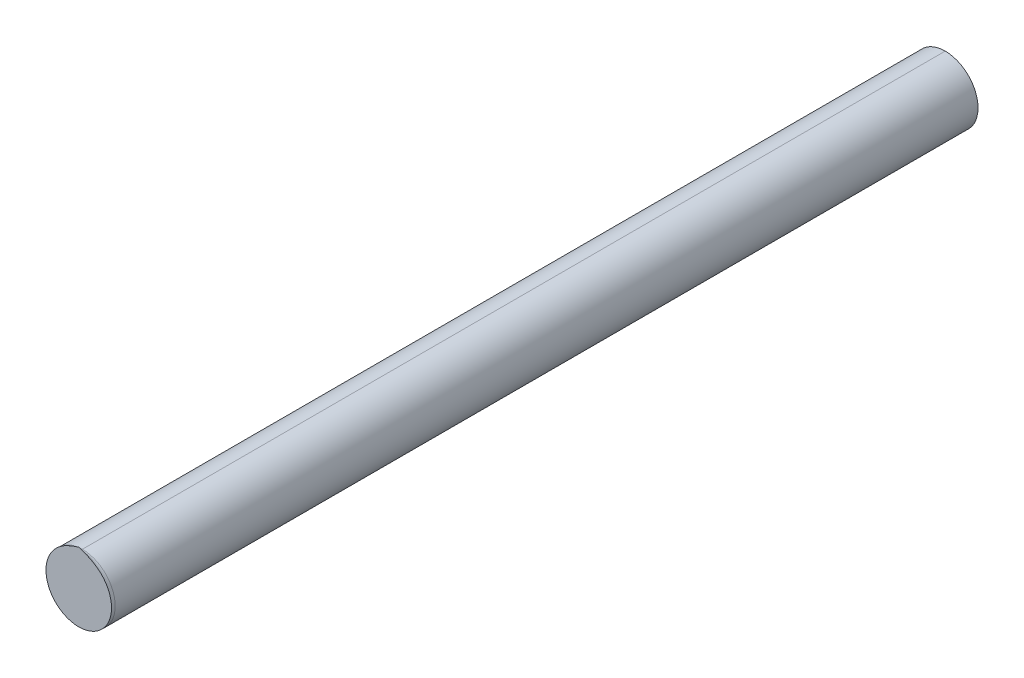
ISO-10303-21;
HEADER;
FILE_DESCRIPTION(('STEP AP214'),'2;1');
FILE_NAME('part.step','',(''),(''),'','','');
FILE_SCHEMA(('AUTOMOTIVE_DESIGN { 1 0 10303 214 1 1 1 1 }'));
ENDSEC;
DATA;
#1=APPLICATION_CONTEXT('core data for automotive mechanical design processes');
#2=APPLICATION_PROTOCOL_DEFINITION('international standard','automotive_design',2000,#1);
#3=PRODUCT_CONTEXT('',#1,'mechanical');
#4=PRODUCT('Part','Part','',(#3));
#5=PRODUCT_RELATED_PRODUCT_CATEGORY('part','',(#4));
#6=PRODUCT_DEFINITION_FORMATION('','',#4);
#7=PRODUCT_DEFINITION_CONTEXT('part definition',#1,'design');
#8=PRODUCT_DEFINITION('design','',#6,#7);
#9=PRODUCT_DEFINITION_SHAPE('','',#8);
#10=(LENGTH_UNIT() NAMED_UNIT(*) SI_UNIT(.MILLI.,.METRE.));
#11=(NAMED_UNIT(*) PLANE_ANGLE_UNIT() SI_UNIT($,.RADIAN.));
#12=(NAMED_UNIT(*) SI_UNIT($,.STERADIAN.) SOLID_ANGLE_UNIT());
#13=UNCERTAINTY_MEASURE_WITH_UNIT(LENGTH_MEASURE(1.E-05),#10,'distance_accuracy_value','');
#14=(GEOMETRIC_REPRESENTATION_CONTEXT(3) GLOBAL_UNCERTAINTY_ASSIGNED_CONTEXT((#13)) GLOBAL_UNIT_ASSIGNED_CONTEXT((#10,
#11,#12)) REPRESENTATION_CONTEXT('',''));
#15=CARTESIAN_POINT('',(0.,0.,0.));
#16=DIRECTION('',(0.,0.,1.));
#17=DIRECTION('',(1.,0.,0.));
#18=AXIS2_PLACEMENT_3D('',#15,#16,#17);
#19=CARTESIAN_POINT('',(0.0127,-2.2352,-7.3152));
#20=DIRECTION('',(0.,0.,1.));
#21=DIRECTION('',(1.,0.,0.));
#22=AXIS2_PLACEMENT_3D('',#19,#20,#21);
#23=PLANE('',#22);
#24=CARTESIAN_POINT('',(0.0127,-2.2352,-7.3152));
#25=DIRECTION('',(0.,0.,1.));
#26=DIRECTION('',(0.,1.,0.));
#27=AXIS2_PLACEMENT_3D('',#24,#25,#26);
#28=CIRCLE('',#27,0.2286);
#29=CARTESIAN_POINT('',(0.0127,-2.0066,-7.3152));
#30=VERTEX_POINT('',#29);
#31=CARTESIAN_POINT('',(0.0127,-2.4638,-7.3152));
#32=VERTEX_POINT('',#31);
#33=EDGE_CURVE('E86',#30,#32,#28,.T.);
#34=ORIENTED_EDGE('',*,*,#33,.F.);
#35=CARTESIAN_POINT('',(0.0127,-2.2352,-7.3152));
#36=DIRECTION('',(0.,0.,1.));
#37=DIRECTION('',(0.,-1.,0.));
#38=AXIS2_PLACEMENT_3D('',#35,#36,#37);
#39=CIRCLE('',#38,0.2286);
#40=EDGE_CURVE('E11',#32,#30,#39,.T.);
#41=ORIENTED_EDGE('',*,*,#40,.F.);
#42=EDGE_LOOP('',(#34,#41));
#43=FACE_BOUND('',#42,.T.);
#44=ADVANCED_FACE('F16',(#43),#23,.F.);
#45=CARTESIAN_POINT('',(0.0127,-2.2352,-1.175004));
#46=DIRECTION('',(0.,0.,1.));
#47=DIRECTION('',(0.,1.,0.));
#48=AXIS2_PLACEMENT_3D('',#45,#46,#47);
#49=CYLINDRICAL_SURFACE('',#48,0.2286);
#50=DIRECTION('',(0.,0.,1.));
#51=VECTOR('',#50,1.);
#52=CARTESIAN_POINT('',(0.0127,-2.4638,-7.3152));
#53=LINE('',#52,#51);
#54=CARTESIAN_POINT('',(0.0127,-2.4638,-1.2954));
#55=VERTEX_POINT('',#54);
#56=EDGE_CURVE('E27',#32,#55,#53,.T.);
#57=ORIENTED_EDGE('',*,*,#56,.F.);
#58=ORIENTED_EDGE('',*,*,#40,.T.);
#59=DIRECTION('',(0.,0.,-1.));
#60=VECTOR('',#59,1.);
#61=CARTESIAN_POINT('',(0.0127,-2.0066,-1.2954));
#62=LINE('',#61,#60);
#63=CARTESIAN_POINT('',(0.0127,-2.0066,-1.2954));
#64=VERTEX_POINT('',#63);
#65=EDGE_CURVE('E20',#64,#30,#62,.T.);
#66=ORIENTED_EDGE('',*,*,#65,.F.);
#67=CARTESIAN_POINT('',(0.0127,-2.2352,-1.2954));
#68=DIRECTION('',(0.,0.,1.));
#69=DIRECTION('',(0.,-1.,0.));
#70=AXIS2_PLACEMENT_3D('',#67,#68,#69);
#71=CIRCLE('',#70,0.2286);
#72=EDGE_CURVE('E76',#55,#64,#71,.T.);
#73=ORIENTED_EDGE('',*,*,#72,.F.);
#74=EDGE_LOOP('',(#57,#58,#66,#73));
#75=FACE_BOUND('',#74,.T.);
#76=ADVANCED_FACE('F104',(#75),#49,.T.);
#77=CARTESIAN_POINT('',(0.0127,-2.2352,-1.175004));
#78=DIRECTION('',(0.,0.,1.));
#79=DIRECTION('',(0.,1.,0.));
#80=AXIS2_PLACEMENT_3D('',#77,#78,#79);
#81=CYLINDRICAL_SURFACE('',#80,0.2286);
#82=ORIENTED_EDGE('',*,*,#65,.T.);
#83=ORIENTED_EDGE('',*,*,#33,.T.);
#84=ORIENTED_EDGE('',*,*,#56,.T.);
#85=CARTESIAN_POINT('',(0.0127,-2.2352,-1.2954));
#86=DIRECTION('',(0.,0.,1.));
#87=DIRECTION('',(0.,1.,0.));
#88=AXIS2_PLACEMENT_3D('',#85,#86,#87);
#89=CIRCLE('',#88,0.2286);
#90=EDGE_CURVE('E69',#64,#55,#89,.T.);
#91=ORIENTED_EDGE('',*,*,#90,.F.);
#92=EDGE_LOOP('',(#82,#83,#84,#91));
#93=FACE_BOUND('',#92,.T.);
#94=ADVANCED_FACE('F101',(#93),#81,.T.);
#95=CARTESIAN_POINT('',(0.0127,-1.9812,-1.2954));
#96=DIRECTION('',(1.,0.,0.));
#97=DIRECTION('',(0.,0.,-1.));
#98=AXIS2_PLACEMENT_3D('',#95,#96,#97);
#99=TOROIDAL_SURFACE('',#98,0.254,0.2286);
#100=CARTESIAN_POINT('',(0.0127,-1.9812,-1.2954));
#101=DIRECTION('',(-1.,0.,0.));
#102=DIRECTION('',(0.,-1.,0.));
#103=AXIS2_PLACEMENT_3D('',#100,#101,#102);
#104=CIRCLE('',#103,0.02539999999997);
#105=CARTESIAN_POINT('',(0.0127,-1.9812,-1.27));
#106=VERTEX_POINT('',#105);
#107=EDGE_CURVE('E62',#64,#106,#104,.T.);
#108=ORIENTED_EDGE('',*,*,#107,.F.);
#109=ORIENTED_EDGE('',*,*,#90,.T.);
#110=CARTESIAN_POINT('',(0.0127,-1.9812,-1.2954));
#111=DIRECTION('',(1.,0.,0.));
#112=DIRECTION('',(0.,-0.998613997947909,0.0526315789473652));
#113=AXIS2_PLACEMENT_3D('',#110,#111,#112);
#114=CIRCLE('',#113,0.4826);
#115=CARTESIAN_POINT('',(0.0127,-2.46313111541,-1.27));
#116=VERTEX_POINT('',#115);
#117=EDGE_CURVE('E65',#116,#55,#114,.T.);
#118=ORIENTED_EDGE('',*,*,#117,.F.);
#119=CARTESIAN_POINT('',(0.0127,-1.9812,-1.27));
#120=CARTESIAN_POINT('',(0.00268453589315,-1.984538488036,-1.27));
#121=CARTESIAN_POINT('',(-0.0162866236036,-1.990888085718,-1.27));
#122=CARTESIAN_POINT('',(-0.04101836429857,-2.000105440641,-1.27));
#123=CARTESIAN_POINT('',(-0.06282604547435,-2.009528596814,-1.27));
#124=CARTESIAN_POINT('',(-0.08229677204331,-2.019375106708,-1.27));
#125=CARTESIAN_POINT('',(-0.100120348057,-2.029905485221,-1.27));
#126=CARTESIAN_POINT('',(-0.116781937252,-2.041377244428,-1.27));
#127=CARTESIAN_POINT('',(-0.132839108017,-2.054271049889,-1.27));
#128=CARTESIAN_POINT('',(-0.148727420945,-2.069274362975,-1.27));
#129=CARTESIAN_POINT('',(-0.16465763385,-2.087284702453,-1.27));
#130=CARTESIAN_POINT('',(-0.180074245921,-2.108884670219,-1.27));
#131=CARTESIAN_POINT('',(-0.193409834517,-2.132961995288,-1.27));
#132=CARTESIAN_POINT('',(-0.203992024449,-2.158858239029,-1.27));
#133=CARTESIAN_POINT('',(-0.211354868407,-2.185597864333,-1.27));
#134=CARTESIAN_POINT('',(-0.21547502175,-2.212817210065,-1.27));
#135=CARTESIAN_POINT('',(-0.216357590024,-2.240134889171,-1.27));
#136=CARTESIAN_POINT('',(-0.213992962384,-2.267479479604,-1.27));
#137=CARTESIAN_POINT('',(-0.20844362143,-2.294173648226,-1.27));
#138=CARTESIAN_POINT('',(-0.199750601001,-2.320094541175,-1.27));
#139=CARTESIAN_POINT('',(-0.188110652602,-2.344674192912,-1.27));
#140=CARTESIAN_POINT('',(-0.173591537047,-2.367782661223,-1.27));
#141=CARTESIAN_POINT('',(-0.156513452433,-2.388911573325,-1.27));
#142=CARTESIAN_POINT('',(-0.136991936718,-2.407928258043,-1.27));
#143=CARTESIAN_POINT('',(-0.115432337378,-2.424435743534,-1.27));
#144=CARTESIAN_POINT('',(-0.09200814571451,-2.438309425313,-1.27));
#145=CARTESIAN_POINT('',(-0.06716824610025,-2.449277535791,-1.27));
#146=CARTESIAN_POINT('',(-0.04116544668276,-2.457240467013,-1.27));
#147=CARTESIAN_POINT('',(-0.0144106131407,-2.462054345774,-1.27));
#148=CARTESIAN_POINT('',(0.003614341446174,-2.46313111541,-1.27));
#149=CARTESIAN_POINT('',(0.0127,-2.46313111541,-1.27));
#150=(BOUNDED_CURVE() B_SPLINE_CURVE(3,(#119,#120,#121,#122,#123,#124,#125,#126,#127,#128,#129,
#130,#131,#132,#133,#134,#135,#136,#137,#138,#139,#140,#141,#142,#143,#144,#145,#146,#147,#148,
#149),.UNSPECIFIED.,.F.,.F.) B_SPLINE_CURVE_WITH_KNOTS((4,1,1,1,1,1,1,1,1,1,1,1,1,1,1,1,1,1,1,1,
1,1,1,1,1,1,1,1,4),(0.,0.03571428571429,0.07142857142857,0.107142857143,0.142857142857,
0.178571428571,0.214285714286,0.25,0.285714285714,0.321428571429,0.357142857143,0.392857142857,
0.428571428571,0.464285714286,0.5,0.535714285714,0.571428571429,0.607142857143,0.642857142857,
0.678571428571,0.714285714286,0.75,0.785714285714,0.821428571429,0.857142857143,0.892857142857,
0.928571428571,0.964285714286,1.),
.UNSPECIFIED.) CURVE() GEOMETRIC_REPRESENTATION_ITEM() RATIONAL_B_SPLINE_CURVE((1.,1.,1.,1.,1.,
1.,1.,1.,1.,1.,1.,1.,1.,1.,1.,1.,1.,1.,1.,1.,1.,1.,1.,1.,1.,1.,1.,1.,1.,1.,1.)) REPRESENTATION_ITEM(''));
#151=EDGE_CURVE('E57',#106,#116,#150,.T.);
#152=ORIENTED_EDGE('',*,*,#151,.F.);
#153=EDGE_LOOP('',(#108,#109,#118,#152));
#154=FACE_BOUND('',#153,.T.);
#155=ADVANCED_FACE('F59',(#154),#99,.T.);
#156=CARTESIAN_POINT('',(0.01270073210946,-2.222165557705,-1.27));
#157=DIRECTION('',(0.,0.,1.));
#158=DIRECTION('',(1.,0.,0.));
#159=AXIS2_PLACEMENT_3D('',#156,#157,#158);
#160=PLANE('',#159);
#161=ORIENTED_EDGE('',*,*,#151,.T.);
#162=CARTESIAN_POINT('',(0.0127,-1.9812,-1.27));
#163=CARTESIAN_POINT('',(0.02282278554111,-1.984574261847,-1.27));
#164=CARTESIAN_POINT('',(0.04197324073834,-1.990984898904,-1.27));
#165=CARTESIAN_POINT('',(0.06685949765465,-2.000279120665,-1.27));
#166=CARTESIAN_POINT('',(0.08871825143982,-2.009757169226,-1.27));
#167=CARTESIAN_POINT('',(0.108185495115,-2.01964304199,-1.27));
#168=CARTESIAN_POINT('',(0.125897486816,-2.030151245219,-1.27));
#169=CARTESIAN_POINT('',(0.142371324548,-2.041523831441,-1.27));
#170=CARTESIAN_POINT('',(0.158301038449,-2.054330924713,-1.27));
#171=CARTESIAN_POINT('',(0.174148102949,-2.069288228342,-1.27));
#172=CARTESIAN_POINT('',(0.19021505004,-2.087482890308,-1.27));
#173=CARTESIAN_POINT('',(0.205476916572,-2.108903114359,-1.27));
#174=CARTESIAN_POINT('',(0.218845003461,-2.133013246442,-1.27));
#175=CARTESIAN_POINT('',(0.229503523895,-2.159167343206,-1.27));
#176=CARTESIAN_POINT('',(0.236813676596,-2.185898107656,-1.27));
#177=CARTESIAN_POINT('',(0.240891682964,-2.213019322054,-1.27));
#178=CARTESIAN_POINT('',(0.241752080197,-2.240342416738,-1.27));
#179=CARTESIAN_POINT('',(0.239364910655,-2.267668842659,-1.27));
#180=CARTESIAN_POINT('',(0.233791695911,-2.294362093667,-1.27));
#181=CARTESIAN_POINT('',(0.225092007512,-2.320237792407,-1.27));
#182=CARTESIAN_POINT('',(0.213434625043,-2.344811296961,-1.27));
#183=CARTESIAN_POINT('',(0.19892141284,-2.367879735307,-1.27));
#184=CARTESIAN_POINT('',(0.181828505387,-2.389003688605,-1.27));
#185=CARTESIAN_POINT('',(0.162327310278,-2.407983118398,-1.27));
#186=CARTESIAN_POINT('',(0.140758068647,-2.424485163832,-1.27));
#187=CARTESIAN_POINT('',(0.117362136112,-2.438332202716,-1.27));
#188=CARTESIAN_POINT('',(0.09251762335626,-2.449295930969,-1.27));
#189=CARTESIAN_POINT('',(0.06654303039861,-2.457244964807,-1.27));
#190=CARTESIAN_POINT('',(0.03979262858271,-2.462056284076,-1.27));
#191=CARTESIAN_POINT('',(0.02177955257305,-2.46313111541,-1.27));
#192=CARTESIAN_POINT('',(0.0127,-2.46313111541,-1.27));
#193=(BOUNDED_CURVE() B_SPLINE_CURVE(3,(#162,#163,#164,#165,#166,#167,#168,#169,#170,#171,#172,
#173,#174,#175,#176,#177,#178,#179,#180,#181,#182,#183,#184,#185,#186,#187,#188,#189,#190,#191,
#192),.UNSPECIFIED.,.F.,.F.) B_SPLINE_CURVE_WITH_KNOTS((4,1,1,1,1,1,1,1,1,1,1,1,1,1,1,1,1,1,1,1,
1,1,1,1,1,1,1,1,4),(0.,0.03571428571429,0.07142857142857,0.107142857143,0.142857142857,
0.178571428571,0.214285714286,0.25,0.285714285714,0.321428571429,0.357142857143,0.392857142857,
0.428571428571,0.464285714286,0.5,0.535714285714,0.571428571429,0.607142857143,0.642857142857,
0.678571428571,0.714285714286,0.75,0.785714285714,0.821428571429,0.857142857143,0.892857142857,
0.928571428571,0.964285714286,1.),
.UNSPECIFIED.) CURVE() GEOMETRIC_REPRESENTATION_ITEM() RATIONAL_B_SPLINE_CURVE((1.,1.,1.,1.,1.,
1.,1.,1.,1.,1.,1.,1.,1.,1.,1.,1.,1.,1.,1.,1.,1.,1.,1.,1.,1.,1.,1.,1.,1.,1.,1.)) REPRESENTATION_ITEM(''));
#194=EDGE_CURVE('E70',#106,#116,#193,.T.);
#195=ORIENTED_EDGE('',*,*,#194,.F.);
#196=EDGE_LOOP('',(#161,#195));
#197=FACE_BOUND('',#196,.T.);
#198=ADVANCED_FACE('F18',(#197),#160,.T.);
#199=CARTESIAN_POINT('',(0.0127,-1.9812,-1.2954));
#200=DIRECTION('',(1.,0.,0.));
#201=DIRECTION('',(0.,0.,-1.));
#202=AXIS2_PLACEMENT_3D('',#199,#200,#201);
#203=TOROIDAL_SURFACE('',#202,0.254,0.2286);
#204=ORIENTED_EDGE('',*,*,#117,.T.);
#205=ORIENTED_EDGE('',*,*,#72,.T.);
#206=ORIENTED_EDGE('',*,*,#107,.T.);
#207=ORIENTED_EDGE('',*,*,#194,.T.);
#208=EDGE_LOOP('',(#204,#205,#206,#207));
#209=FACE_BOUND('',#208,.T.);
#210=ADVANCED_FACE('F74',(#209),#203,.T.);
#211=CLOSED_SHELL('',(#44,#76,#94,#155,#198,#210));
#212=MANIFOLD_SOLID_BREP('B1',#211);
#213=ADVANCED_BREP_SHAPE_REPRESENTATION('',(#18,#212),#14);
#214=SHAPE_DEFINITION_REPRESENTATION(#9,#213);
ENDSEC;
END-ISO-10303-21;
